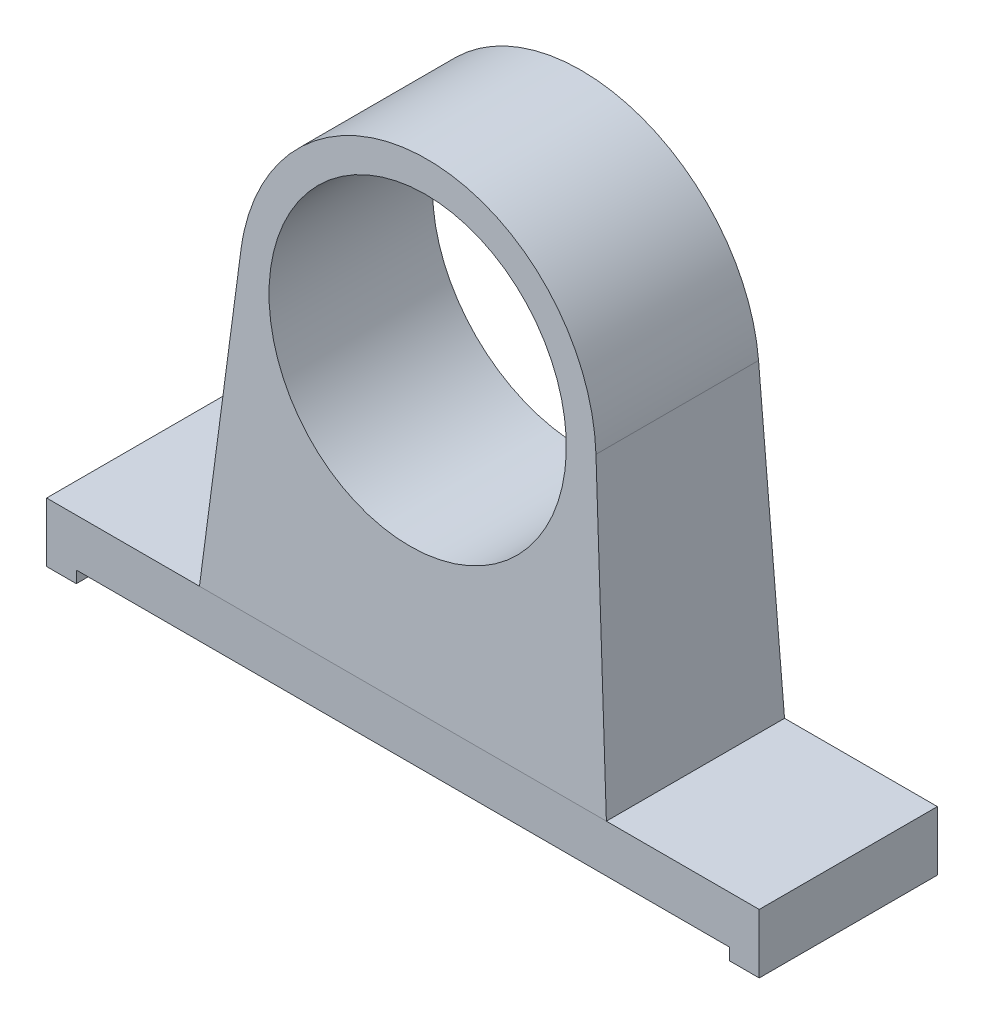
ISO-10303-21;
HEADER;
FILE_DESCRIPTION(('STEP AP214'),'2;1');
FILE_NAME('part.step','',(''),(''),'','','');
FILE_SCHEMA(('AUTOMOTIVE_DESIGN { 1 0 10303 214 1 1 1 1 }'));
ENDSEC;
DATA;
#1=APPLICATION_CONTEXT('core data for automotive mechanical design processes');
#2=APPLICATION_PROTOCOL_DEFINITION('international standard','automotive_design',2000,#1);
#3=PRODUCT_CONTEXT('',#1,'mechanical');
#4=PRODUCT('Part','Part','',(#3));
#5=PRODUCT_RELATED_PRODUCT_CATEGORY('part','',(#4));
#6=PRODUCT_DEFINITION_FORMATION('','',#4);
#7=PRODUCT_DEFINITION_CONTEXT('part definition',#1,'design');
#8=PRODUCT_DEFINITION('design','',#6,#7);
#9=PRODUCT_DEFINITION_SHAPE('','',#8);
#10=(LENGTH_UNIT() NAMED_UNIT(*) SI_UNIT(.MILLI.,.METRE.));
#11=(NAMED_UNIT(*) PLANE_ANGLE_UNIT() SI_UNIT($,.RADIAN.));
#12=(NAMED_UNIT(*) SI_UNIT($,.STERADIAN.) SOLID_ANGLE_UNIT());
#13=UNCERTAINTY_MEASURE_WITH_UNIT(LENGTH_MEASURE(1.E-05),#10,'distance_accuracy_value','');
#14=(GEOMETRIC_REPRESENTATION_CONTEXT(3) GLOBAL_UNCERTAINTY_ASSIGNED_CONTEXT((#13)) GLOBAL_UNIT_ASSIGNED_CONTEXT((#10,
#11,#12)) REPRESENTATION_CONTEXT('',''));
#15=CARTESIAN_POINT('',(0.,0.,0.));
#16=DIRECTION('',(0.,0.,1.));
#17=DIRECTION('',(1.,0.,0.));
#18=AXIS2_PLACEMENT_3D('',#15,#16,#17);
#19=CARTESIAN_POINT('',(-30.,5.,7.5));
#20=DIRECTION('',(0.,0.,-1.));
#21=DIRECTION('',(-1.,0.,0.));
#22=AXIS2_PLACEMENT_3D('',#19,#20,#21);
#23=PLANE('',#22);
#24=DIRECTION('',(-1.,0.,0.));
#25=VECTOR('',#24,1.);
#26=CARTESIAN_POINT('',(0.,5.,7.5));
#27=LINE('',#26,#25);
#28=CARTESIAN_POINT('',(-17.1301370595244,4.99999999999996,7.5));
#29=VERTEX_POINT('',#28);
#30=CARTESIAN_POINT('',(17.1301370595244,5.,7.5));
#31=VERTEX_POINT('',#30);
#32=EDGE_CURVE('E11',#29,#31,#27,.F.);
#33=ORIENTED_EDGE('',*,*,#32,.F.);
#34=DIRECTION('',(1.,0.,0.));
#35=VECTOR('',#34,1.);
#36=CARTESIAN_POINT('',(-30.,5.,7.5));
#37=LINE('',#36,#35);
#38=CARTESIAN_POINT('',(-30.,5.,7.5));
#39=VERTEX_POINT('',#38);
#40=EDGE_CURVE('E82',#39,#29,#37,.T.);
#41=ORIENTED_EDGE('',*,*,#40,.F.);
#42=DIRECTION('',(0.,-1.,0.));
#43=VECTOR('',#42,1.);
#44=CARTESIAN_POINT('',(-30.,5.,7.5));
#45=LINE('',#44,#43);
#46=CARTESIAN_POINT('',(-30.,0.,7.5));
#47=VERTEX_POINT('',#46);
#48=EDGE_CURVE('E117',#39,#47,#45,.T.);
#49=ORIENTED_EDGE('',*,*,#48,.T.);
#50=DIRECTION('',(1.,0.,0.));
#51=VECTOR('',#50,1.);
#52=CARTESIAN_POINT('',(-30.,0.,7.5));
#53=LINE('',#52,#51);
#54=CARTESIAN_POINT('',(-27.5,0.,7.5));
#55=VERTEX_POINT('',#54);
#56=EDGE_CURVE('E133',#47,#55,#53,.T.);
#57=ORIENTED_EDGE('',*,*,#56,.T.);
#58=DIRECTION('',(0.,-1.,0.));
#59=VECTOR('',#58,1.);
#60=CARTESIAN_POINT('',(-27.5,-1.,7.5));
#61=LINE('',#60,#59);
#62=CARTESIAN_POINT('',(-27.5,1.,7.5));
#63=VERTEX_POINT('',#62);
#64=EDGE_CURVE('E54',#63,#55,#61,.T.);
#65=ORIENTED_EDGE('',*,*,#64,.F.);
#66=DIRECTION('',(-1.,0.,0.));
#67=VECTOR('',#66,1.);
#68=CARTESIAN_POINT('',(-27.5,1.,7.5));
#69=LINE('',#68,#67);
#70=CARTESIAN_POINT('',(27.5,1.,7.5));
#71=VERTEX_POINT('',#70);
#72=EDGE_CURVE('E214',#71,#63,#69,.T.);
#73=ORIENTED_EDGE('',*,*,#72,.F.);
#74=DIRECTION('',(0.,1.,0.));
#75=VECTOR('',#74,1.);
#76=CARTESIAN_POINT('',(27.5,-1.,7.5));
#77=LINE('',#76,#75);
#78=CARTESIAN_POINT('',(27.5,0.,7.5));
#79=VERTEX_POINT('',#78);
#80=EDGE_CURVE('E211',#79,#71,#77,.T.);
#81=ORIENTED_EDGE('',*,*,#80,.F.);
#82=CARTESIAN_POINT('',(30.,0.,7.5));
#83=VERTEX_POINT('',#82);
#84=EDGE_CURVE('E132',#79,#83,#53,.T.);
#85=ORIENTED_EDGE('',*,*,#84,.T.);
#86=DIRECTION('',(0.,-1.,0.));
#87=VECTOR('',#86,1.);
#88=CARTESIAN_POINT('',(30.,5.,7.5));
#89=LINE('',#88,#87);
#90=CARTESIAN_POINT('',(30.,5.,7.5));
#91=VERTEX_POINT('',#90);
#92=EDGE_CURVE('E114',#91,#83,#89,.T.);
#93=ORIENTED_EDGE('',*,*,#92,.F.);
#94=EDGE_CURVE('E85',#31,#91,#37,.T.);
#95=ORIENTED_EDGE('',*,*,#94,.F.);
#96=EDGE_LOOP('',(#33,#41,#49,#57,#65,#73,#81,#85,#93,#95));
#97=FACE_BOUND('',#96,.T.);
#98=ADVANCED_FACE('F35',(#97),#23,.F.);
#99=CARTESIAN_POINT('',(0.,0.,0.));
#100=DIRECTION('',(0.,-1.,0.));
#101=DIRECTION('',(0.,0.,-1.));
#102=AXIS2_PLACEMENT_3D('',#99,#100,#101);
#103=PLANE('',#102);
#104=DIRECTION('',(0.,0.,1.));
#105=VECTOR('',#104,1.);
#106=CARTESIAN_POINT('',(27.5,0.,0.));
#107=LINE('',#106,#105);
#108=CARTESIAN_POINT('',(27.5,0.,-7.5));
#109=VERTEX_POINT('',#108);
#110=EDGE_CURVE('E46',#109,#79,#107,.T.);
#111=ORIENTED_EDGE('',*,*,#110,.F.);
#112=DIRECTION('',(-1.,0.,0.));
#113=VECTOR('',#112,1.);
#114=CARTESIAN_POINT('',(-30.,0.,-7.5));
#115=LINE('',#114,#113);
#116=CARTESIAN_POINT('',(30.,0.,-7.5));
#117=VERTEX_POINT('',#116);
#118=EDGE_CURVE('E126',#117,#109,#115,.T.);
#119=ORIENTED_EDGE('',*,*,#118,.F.);
#120=DIRECTION('',(0.,0.,-1.));
#121=VECTOR('',#120,1.);
#122=CARTESIAN_POINT('',(30.,0.,7.5));
#123=LINE('',#122,#121);
#124=EDGE_CURVE('E122',#83,#117,#123,.T.);
#125=ORIENTED_EDGE('',*,*,#124,.F.);
#126=ORIENTED_EDGE('',*,*,#84,.F.);
#127=EDGE_LOOP('',(#111,#119,#125,#126));
#128=FACE_BOUND('',#127,.T.);
#129=ADVANCED_FACE('F245',(#128),#103,.T.);
#130=CARTESIAN_POINT('',(0.,5.,0.));
#131=DIRECTION('',(0.,-1.,0.));
#132=DIRECTION('',(0.,0.,-1.));
#133=AXIS2_PLACEMENT_3D('',#130,#131,#132);
#134=PLANE('',#133);
#135=DIRECTION('',(0.,0.,-1.));
#136=VECTOR('',#135,1.);
#137=CARTESIAN_POINT('',(17.1301370595244,5.,59.1806406616762));
#138=LINE('',#137,#136);
#139=CARTESIAN_POINT('',(17.1301370595244,5.,-7.5));
#140=VERTEX_POINT('',#139);
#141=EDGE_CURVE('E149',#31,#140,#138,.T.);
#142=ORIENTED_EDGE('',*,*,#141,.F.);
#143=ORIENTED_EDGE('',*,*,#94,.T.);
#144=DIRECTION('',(0.,0.,-1.));
#145=VECTOR('',#144,1.);
#146=CARTESIAN_POINT('',(30.,5.,7.5));
#147=LINE('',#146,#145);
#148=CARTESIAN_POINT('',(30.,5.,-7.5));
#149=VERTEX_POINT('',#148);
#150=EDGE_CURVE('E135',#91,#149,#147,.T.);
#151=ORIENTED_EDGE('',*,*,#150,.T.);
#152=DIRECTION('',(-1.,0.,0.));
#153=VECTOR('',#152,1.);
#154=CARTESIAN_POINT('',(-30.,5.,-7.5));
#155=LINE('',#154,#153);
#156=EDGE_CURVE('E166',#149,#140,#155,.T.);
#157=ORIENTED_EDGE('',*,*,#156,.T.);
#158=EDGE_LOOP('',(#142,#143,#151,#157));
#159=FACE_BOUND('',#158,.T.);
#160=ADVANCED_FACE('F274',(#159),#134,.F.);
#161=CARTESIAN_POINT('',(30.,5.,7.5));
#162=DIRECTION('',(-1.,0.,0.));
#163=DIRECTION('',(0.,0.,1.));
#164=AXIS2_PLACEMENT_3D('',#161,#162,#163);
#165=PLANE('',#164);
#166=ORIENTED_EDGE('',*,*,#124,.T.);
#167=DIRECTION('',(0.,-1.,0.));
#168=VECTOR('',#167,1.);
#169=CARTESIAN_POINT('',(30.,5.,-7.5));
#170=LINE('',#169,#168);
#171=EDGE_CURVE('E141',#149,#117,#170,.T.);
#172=ORIENTED_EDGE('',*,*,#171,.F.);
#173=ORIENTED_EDGE('',*,*,#150,.F.);
#174=ORIENTED_EDGE('',*,*,#92,.T.);
#175=EDGE_LOOP('',(#166,#172,#173,#174));
#176=FACE_BOUND('',#175,.T.);
#177=ADVANCED_FACE('F243',(#176),#165,.F.);
#178=CARTESIAN_POINT('',(-30.,5.,-7.5));
#179=DIRECTION('',(0.,0.,1.));
#180=DIRECTION('',(1.,0.,0.));
#181=AXIS2_PLACEMENT_3D('',#178,#179,#180);
#182=PLANE('',#181);
#183=ORIENTED_EDGE('',*,*,#118,.T.);
#184=DIRECTION('',(0.,1.,0.));
#185=VECTOR('',#184,1.);
#186=CARTESIAN_POINT('',(27.5,-1.,-7.5));
#187=LINE('',#186,#185);
#188=CARTESIAN_POINT('',(27.5,1.,-7.5));
#189=VERTEX_POINT('',#188);
#190=EDGE_CURVE('E207',#109,#189,#187,.T.);
#191=ORIENTED_EDGE('',*,*,#190,.T.);
#192=DIRECTION('',(-1.,0.,0.));
#193=VECTOR('',#192,1.);
#194=CARTESIAN_POINT('',(-27.5,1.,-7.5));
#195=LINE('',#194,#193);
#196=CARTESIAN_POINT('',(-27.5,1.,-7.5));
#197=VERTEX_POINT('',#196);
#198=EDGE_CURVE('E201',#189,#197,#195,.T.);
#199=ORIENTED_EDGE('',*,*,#198,.T.);
#200=DIRECTION('',(0.,-1.,0.));
#201=VECTOR('',#200,1.);
#202=CARTESIAN_POINT('',(-27.5,-1.,-7.5));
#203=LINE('',#202,#201);
#204=CARTESIAN_POINT('',(-27.5,0.,-7.5));
#205=VERTEX_POINT('',#204);
#206=EDGE_CURVE('E194',#197,#205,#203,.T.);
#207=ORIENTED_EDGE('',*,*,#206,.T.);
#208=CARTESIAN_POINT('',(-30.,0.,-7.5));
#209=VERTEX_POINT('',#208);
#210=EDGE_CURVE('E125',#205,#209,#115,.T.);
#211=ORIENTED_EDGE('',*,*,#210,.T.);
#212=DIRECTION('',(0.,-1.,0.));
#213=VECTOR('',#212,1.);
#214=CARTESIAN_POINT('',(-30.,5.,-7.5));
#215=LINE('',#214,#213);
#216=CARTESIAN_POINT('',(-30.,5.,-7.5));
#217=VERTEX_POINT('',#216);
#218=EDGE_CURVE('E138',#217,#209,#215,.T.);
#219=ORIENTED_EDGE('',*,*,#218,.F.);
#220=CARTESIAN_POINT('',(-17.1301370595244,5.,-7.5));
#221=VERTEX_POINT('',#220);
#222=EDGE_CURVE('E165',#221,#217,#155,.T.);
#223=ORIENTED_EDGE('',*,*,#222,.F.);
#224=DIRECTION('',(0.0871557427476618,0.996194698091745,0.));
#225=VECTOR('',#224,1.);
#226=CARTESIAN_POINT('',(-17.1301370595244,5.,-7.5));
#227=LINE('',#226,#225);
#228=CARTESIAN_POINT('',(-14.9429204713762,30.,-7.5));
#229=VERTEX_POINT('',#228);
#230=EDGE_CURVE('E102',#221,#229,#227,.T.);
#231=ORIENTED_EDGE('',*,*,#230,.T.);
#232=CARTESIAN_POINT('',(0.,28.6926638587851,-7.5));
#233=DIRECTION('',(0.,0.,1.));
#234=DIRECTION('',(1.,0.,0.));
#235=AXIS2_PLACEMENT_3D('',#232,#233,#234);
#236=CIRCLE('',#235,15.);
#237=CARTESIAN_POINT('',(14.9429204713762,30.,-7.5));
#238=VERTEX_POINT('',#237);
#239=EDGE_CURVE('E218',#229,#238,#236,.F.);
#240=ORIENTED_EDGE('',*,*,#239,.T.);
#241=DIRECTION('',(0.0871557427476618,-0.996194698091745,0.));
#242=VECTOR('',#241,1.);
#243=CARTESIAN_POINT('',(14.9429204713762,30.,-7.5));
#244=LINE('',#243,#242);
#245=EDGE_CURVE('E220',#238,#140,#244,.T.);
#246=ORIENTED_EDGE('',*,*,#245,.T.);
#247=ORIENTED_EDGE('',*,*,#156,.F.);
#248=ORIENTED_EDGE('',*,*,#171,.T.);
#249=EDGE_LOOP('',(#183,#191,#199,#207,#211,#219,#223,#231,#240,#246,#247,#248));
#250=FACE_BOUND('',#249,.T.);
#251=CARTESIAN_POINT('',(0.,28.6926638587851,-7.5));
#252=DIRECTION('',(0.,0.,1.));
#253=DIRECTION('',(1.,0.,0.));
#254=AXIS2_PLACEMENT_3D('',#251,#252,#253);
#255=CIRCLE('',#254,12.5);
#256=CARTESIAN_POINT('',(12.5,28.6926638587851,-7.5));
#257=VERTEX_POINT('',#256);
#258=EDGE_CURVE('E107',#257,#257,#255,.F.);
#259=ORIENTED_EDGE('',*,*,#258,.F.);
#260=EDGE_LOOP('',(#259));
#261=FACE_BOUND('',#260,.T.);
#262=ADVANCED_FACE('F176',(#250,#261),#182,.F.);
#263=CARTESIAN_POINT('',(-30.,5.,7.5));
#264=DIRECTION('',(1.,0.,0.));
#265=DIRECTION('',(0.,0.,-1.));
#266=AXIS2_PLACEMENT_3D('',#263,#264,#265);
#267=PLANE('',#266);
#268=DIRECTION('',(0.,0.,1.));
#269=VECTOR('',#268,1.);
#270=CARTESIAN_POINT('',(-30.,0.,7.5));
#271=LINE('',#270,#269);
#272=EDGE_CURVE('E129',#209,#47,#271,.T.);
#273=ORIENTED_EDGE('',*,*,#272,.T.);
#274=ORIENTED_EDGE('',*,*,#48,.F.);
#275=DIRECTION('',(0.,0.,1.));
#276=VECTOR('',#275,1.);
#277=CARTESIAN_POINT('',(-30.,5.,7.5));
#278=LINE('',#277,#276);
#279=EDGE_CURVE('E112',#217,#39,#278,.T.);
#280=ORIENTED_EDGE('',*,*,#279,.F.);
#281=ORIENTED_EDGE('',*,*,#218,.T.);
#282=EDGE_LOOP('',(#273,#274,#280,#281));
#283=FACE_BOUND('',#282,.T.);
#284=ADVANCED_FACE('F182',(#283),#267,.F.);
#285=CARTESIAN_POINT('',(0.,5.,7.5));
#286=DIRECTION('',(0.,0.0523359562429439,0.998629534754574));
#287=DIRECTION('',(0.,-0.998629534754574,0.052335956242944));
#288=AXIS2_PLACEMENT_3D('',#285,#286,#287);
#289=PLANE('',#288);
#290=DIRECTION('',(-0.0870372042918509,-0.994839797341938,0.0521373445210818));
#291=VECTOR('',#290,1.);
#292=CARTESIAN_POINT('',(-17.3646580551182,2.31941275426735,7.64048362472329));
#293=LINE('',#292,#291);
#294=CARTESIAN_POINT('',(-14.9429204713762,30.,6.18980551792397));
#295=VERTEX_POINT('',#294);
#296=EDGE_CURVE('E87',#29,#295,#293,.F.);
#297=ORIENTED_EDGE('',*,*,#296,.F.);
#298=ORIENTED_EDGE('',*,*,#32,.T.);
#299=DIRECTION('',(-0.0870372042918509,0.994839797341938,-0.0521373445210818));
#300=VECTOR('',#299,1.);
#301=CARTESIAN_POINT('',(15.1833869837133,27.2514551869246,6.33385064783717));
#302=LINE('',#301,#300);
#303=CARTESIAN_POINT('',(14.9429204713762,30.,6.18980551792397));
#304=VERTEX_POINT('',#303);
#305=EDGE_CURVE('E106',#304,#31,#302,.F.);
#306=ORIENTED_EDGE('',*,*,#305,.F.);
#307=CARTESIAN_POINT('',(0.,28.6926638587851,6.2583201018615));
#308=DIRECTION('',(0.,0.0523359562429439,0.998629534754574));
#309=DIRECTION('',(0.,0.998629534754574,-0.052335956242944));
#310=AXIS2_PLACEMENT_3D('',#307,#308,#309);
#311=ELLIPSE('',#310,15.0205851899688,15.);
#312=EDGE_CURVE('E91',#295,#304,#311,.F.);
#313=ORIENTED_EDGE('',*,*,#312,.F.);
#314=EDGE_LOOP('',(#297,#298,#306,#313));
#315=FACE_BOUND('',#314,.T.);
#316=CARTESIAN_POINT('',(0.,28.6926638587851,6.2583201018615));
#317=DIRECTION('',(0.,0.0523359562429439,0.998629534754574));
#318=DIRECTION('',(0.,0.998629534754574,-0.052335956242944));
#319=AXIS2_PLACEMENT_3D('',#316,#317,#318);
#320=ELLIPSE('',#319,12.517154324974,12.5);
#321=CARTESIAN_POINT('',(0.,41.1926638587851,5.60322286082349));
#322=VERTEX_POINT('',#321);
#323=EDGE_CURVE('E39',#322,#322,#320,.F.);
#324=ORIENTED_EDGE('',*,*,#323,.T.);
#325=EDGE_LOOP('',(#324));
#326=FACE_BOUND('',#325,.T.);
#327=ADVANCED_FACE('F37',(#315,#326),#289,.T.);
#328=ORIENTED_EDGE('',*,*,#40,.T.);
#329=DIRECTION('',(0.,0.,-1.));
#330=VECTOR('',#329,1.);
#331=CARTESIAN_POINT('',(-17.1301370595244,5.,59.1806406616762));
#332=LINE('',#331,#330);
#333=EDGE_CURVE('E99',#29,#221,#332,.T.);
#334=ORIENTED_EDGE('',*,*,#333,.T.);
#335=ORIENTED_EDGE('',*,*,#222,.T.);
#336=ORIENTED_EDGE('',*,*,#279,.T.);
#337=EDGE_LOOP('',(#328,#334,#335,#336));
#338=FACE_BOUND('',#337,.T.);
#339=ADVANCED_FACE('F110',(#338),#134,.F.);
#340=DIRECTION('',(0.,0.,-1.));
#341=VECTOR('',#340,1.);
#342=CARTESIAN_POINT('',(-27.5,0.,0.));
#343=LINE('',#342,#341);
#344=EDGE_CURVE('E144',#55,#205,#343,.T.);
#345=ORIENTED_EDGE('',*,*,#344,.F.);
#346=ORIENTED_EDGE('',*,*,#56,.F.);
#347=ORIENTED_EDGE('',*,*,#272,.F.);
#348=ORIENTED_EDGE('',*,*,#210,.F.);
#349=EDGE_LOOP('',(#345,#346,#347,#348));
#350=FACE_BOUND('',#349,.T.);
#351=ADVANCED_FACE('F189',(#350),#103,.T.);
#352=CARTESIAN_POINT('',(14.9429204713762,30.,59.1806406616762));
#353=DIRECTION('',(-0.996194698091745,-0.0871557427476618,0.));
#354=DIRECTION('',(0.0871557427476618,-0.996194698091745,0.));
#355=AXIS2_PLACEMENT_3D('',#352,#353,#354);
#356=PLANE('',#355);
#357=DIRECTION('',(0.,0.,-1.));
#358=VECTOR('',#357,1.);
#359=CARTESIAN_POINT('',(14.9429204713762,30.,59.1806406616762));
#360=LINE('',#359,#358);
#361=EDGE_CURVE('E96',#304,#238,#360,.T.);
#362=ORIENTED_EDGE('',*,*,#361,.F.);
#363=ORIENTED_EDGE('',*,*,#305,.T.);
#364=ORIENTED_EDGE('',*,*,#141,.T.);
#365=ORIENTED_EDGE('',*,*,#245,.F.);
#366=EDGE_LOOP('',(#362,#363,#364,#365));
#367=FACE_BOUND('',#366,.T.);
#368=ADVANCED_FACE('F228',(#367),#356,.F.);
#369=CARTESIAN_POINT('',(0.,28.6926638587851,59.1806406616762));
#370=DIRECTION('',(0.,0.,-1.));
#371=DIRECTION('',(-1.,0.,0.));
#372=AXIS2_PLACEMENT_3D('',#369,#370,#371);
#373=CYLINDRICAL_SURFACE('',#372,15.);
#374=DIRECTION('',(0.,0.,-1.));
#375=VECTOR('',#374,1.);
#376=CARTESIAN_POINT('',(-14.9429204713762,30.,59.1806406616762));
#377=LINE('',#376,#375);
#378=EDGE_CURVE('E95',#295,#229,#377,.T.);
#379=ORIENTED_EDGE('',*,*,#378,.F.);
#380=ORIENTED_EDGE('',*,*,#312,.T.);
#381=ORIENTED_EDGE('',*,*,#361,.T.);
#382=ORIENTED_EDGE('',*,*,#239,.F.);
#383=EDGE_LOOP('',(#379,#380,#381,#382));
#384=FACE_BOUND('',#383,.T.);
#385=ADVANCED_FACE('F226',(#384),#373,.T.);
#386=CARTESIAN_POINT('',(-17.1301370595244,5.,59.1806406616762));
#387=DIRECTION('',(0.996194698091745,-0.0871557427476618,0.));
#388=DIRECTION('',(0.0871557427476618,0.996194698091745,0.));
#389=AXIS2_PLACEMENT_3D('',#386,#387,#388);
#390=PLANE('',#389);
#391=ORIENTED_EDGE('',*,*,#333,.F.);
#392=ORIENTED_EDGE('',*,*,#296,.T.);
#393=ORIENTED_EDGE('',*,*,#378,.T.);
#394=ORIENTED_EDGE('',*,*,#230,.F.);
#395=EDGE_LOOP('',(#391,#392,#393,#394));
#396=FACE_BOUND('',#395,.T.);
#397=ADVANCED_FACE('F100',(#396),#390,.F.);
#398=CARTESIAN_POINT('',(0.,28.6926638587851,59.1806406616762));
#399=DIRECTION('',(0.,0.,-1.));
#400=DIRECTION('',(-1.,0.,0.));
#401=AXIS2_PLACEMENT_3D('',#398,#399,#400);
#402=CYLINDRICAL_SURFACE('',#401,12.5);
#403=ORIENTED_EDGE('',*,*,#323,.F.);
#404=EDGE_LOOP('',(#403));
#405=FACE_BOUND('',#404,.T.);
#406=ORIENTED_EDGE('',*,*,#258,.T.);
#407=EDGE_LOOP('',(#406));
#408=FACE_BOUND('',#407,.T.);
#409=ADVANCED_FACE('F326',(#405,#408),#402,.F.);
#410=CARTESIAN_POINT('',(27.5,-1.,-7.5));
#411=DIRECTION('',(1.,0.,0.));
#412=DIRECTION('',(0.,0.,-1.));
#413=AXIS2_PLACEMENT_3D('',#410,#411,#412);
#414=PLANE('',#413);
#415=ORIENTED_EDGE('',*,*,#110,.T.);
#416=ORIENTED_EDGE('',*,*,#80,.T.);
#417=DIRECTION('',(0.,0.,1.));
#418=VECTOR('',#417,1.);
#419=CARTESIAN_POINT('',(27.5,1.,-7.5));
#420=LINE('',#419,#418);
#421=EDGE_CURVE('E202',#189,#71,#420,.T.);
#422=ORIENTED_EDGE('',*,*,#421,.F.);
#423=ORIENTED_EDGE('',*,*,#190,.F.);
#424=EDGE_LOOP('',(#415,#416,#422,#423));
#425=FACE_BOUND('',#424,.T.);
#426=ADVANCED_FACE('F259',(#425),#414,.F.);
#427=CARTESIAN_POINT('',(-27.5,-1.,-7.5));
#428=DIRECTION('',(-1.,0.,0.));
#429=DIRECTION('',(0.,0.,1.));
#430=AXIS2_PLACEMENT_3D('',#427,#428,#429);
#431=PLANE('',#430);
#432=ORIENTED_EDGE('',*,*,#344,.T.);
#433=ORIENTED_EDGE('',*,*,#206,.F.);
#434=DIRECTION('',(0.,0.,1.));
#435=VECTOR('',#434,1.);
#436=CARTESIAN_POINT('',(-27.5,1.,-7.5));
#437=LINE('',#436,#435);
#438=EDGE_CURVE('E205',#197,#63,#437,.T.);
#439=ORIENTED_EDGE('',*,*,#438,.T.);
#440=ORIENTED_EDGE('',*,*,#64,.T.);
#441=EDGE_LOOP('',(#432,#433,#439,#440));
#442=FACE_BOUND('',#441,.T.);
#443=ADVANCED_FACE('F192',(#442),#431,.F.);
#444=CARTESIAN_POINT('',(-27.5,1.,-7.5));
#445=DIRECTION('',(0.,1.,0.));
#446=DIRECTION('',(0.,0.,1.));
#447=AXIS2_PLACEMENT_3D('',#444,#445,#446);
#448=PLANE('',#447);
#449=ORIENTED_EDGE('',*,*,#72,.T.);
#450=ORIENTED_EDGE('',*,*,#438,.F.);
#451=ORIENTED_EDGE('',*,*,#198,.F.);
#452=ORIENTED_EDGE('',*,*,#421,.T.);
#453=EDGE_LOOP('',(#449,#450,#451,#452));
#454=FACE_BOUND('',#453,.T.);
#455=ADVANCED_FACE('F261',(#454),#448,.F.);
#456=CLOSED_SHELL('',(#98,#129,#160,#177,#262,#284,#327,#339,#351,#368,#385,#397,#409,#426,#443,#455));
#457=MANIFOLD_SOLID_BREP('B2',#456);
#458=ADVANCED_BREP_SHAPE_REPRESENTATION('',(#18,#457),#14);
#459=SHAPE_DEFINITION_REPRESENTATION(#9,#458);
ENDSEC;
END-ISO-10303-21;
